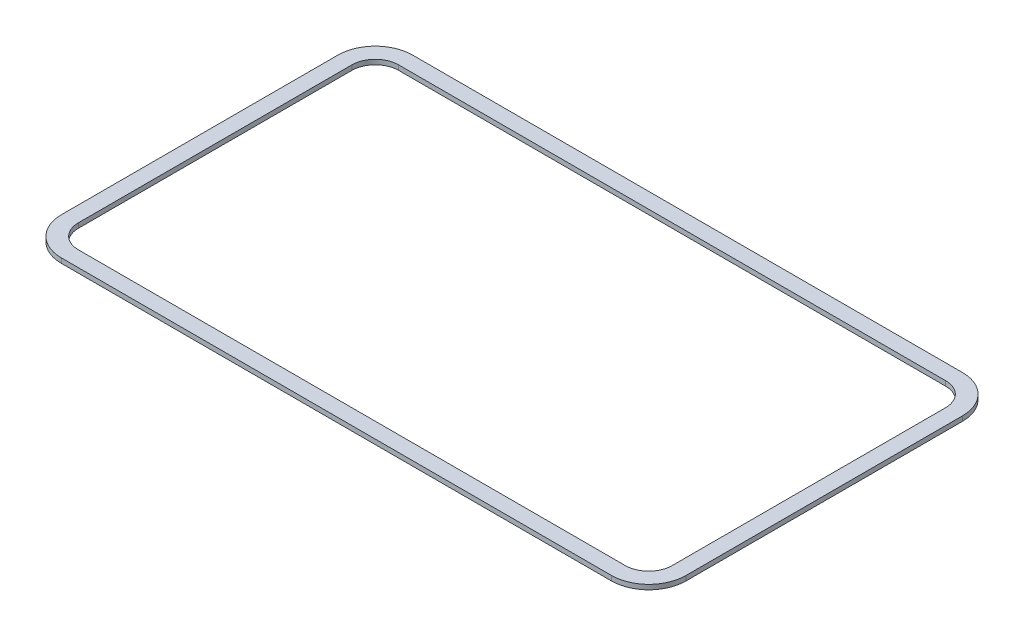
ISO-10303-21;
HEADER;
FILE_DESCRIPTION(('STEP AP214'),'2;1');
FILE_NAME('part.step','',(''),(''),'','','');
FILE_SCHEMA(('AUTOMOTIVE_DESIGN { 1 0 10303 214 1 1 1 1 }'));
ENDSEC;
DATA;
#1=APPLICATION_CONTEXT('core data for automotive mechanical design processes');
#2=APPLICATION_PROTOCOL_DEFINITION('international standard','automotive_design',2000,#1);
#3=PRODUCT_CONTEXT('',#1,'mechanical');
#4=PRODUCT('Part','Part','',(#3));
#5=PRODUCT_RELATED_PRODUCT_CATEGORY('part','',(#4));
#6=PRODUCT_DEFINITION_FORMATION('','',#4);
#7=PRODUCT_DEFINITION_CONTEXT('part definition',#1,'design');
#8=PRODUCT_DEFINITION('design','',#6,#7);
#9=PRODUCT_DEFINITION_SHAPE('','',#8);
#10=(LENGTH_UNIT() NAMED_UNIT(*) SI_UNIT(.MILLI.,.METRE.));
#11=(NAMED_UNIT(*) PLANE_ANGLE_UNIT() SI_UNIT($,.RADIAN.));
#12=(NAMED_UNIT(*) SI_UNIT($,.STERADIAN.) SOLID_ANGLE_UNIT());
#13=UNCERTAINTY_MEASURE_WITH_UNIT(LENGTH_MEASURE(1.E-05),#10,'distance_accuracy_value','');
#14=(GEOMETRIC_REPRESENTATION_CONTEXT(3) GLOBAL_UNCERTAINTY_ASSIGNED_CONTEXT((#13)) GLOBAL_UNIT_ASSIGNED_CONTEXT((#10,
#11,#12)) REPRESENTATION_CONTEXT('',''));
#15=CARTESIAN_POINT('',(0.,0.,0.));
#16=DIRECTION('',(0.,0.,1.));
#17=DIRECTION('',(1.,0.,0.));
#18=AXIS2_PLACEMENT_3D('',#15,#16,#17);
#19=CARTESIAN_POINT('',(-10.,114.579795605042,-10.));
#20=DIRECTION('',(0.,-1.,0.));
#21=DIRECTION('',(0.,0.,-1.));
#22=AXIS2_PLACEMENT_3D('',#19,#20,#21);
#23=CYLINDRICAL_SURFACE('',#22,7.7038728258217);
#24=CARTESIAN_POINT('',(-10.,113.001,-10.));
#25=DIRECTION('',(0.,1.,0.));
#26=DIRECTION('',(0.,0.,1.));
#27=AXIS2_PLACEMENT_3D('',#24,#25,#26);
#28=CIRCLE('',#27,7.7038728258217);
#29=CARTESIAN_POINT('',(-10.,113.001,-2.2961271741783));
#30=VERTEX_POINT('',#29);
#31=CARTESIAN_POINT('',(-2.29612717417829,113.001,-10.));
#32=VERTEX_POINT('',#31);
#33=EDGE_CURVE('E188',#30,#32,#28,.T.);
#34=ORIENTED_EDGE('',*,*,#33,.F.);
#35=DIRECTION('',(0.,-1.,0.));
#36=VECTOR('',#35,1.);
#37=CARTESIAN_POINT('',(-10.,114.579795605042,-2.2961271741783));
#38=LINE('',#37,#36);
#39=CARTESIAN_POINT('',(-10.,114.579795605042,-2.2961271741783));
#40=VERTEX_POINT('',#39);
#41=EDGE_CURVE('E35',#40,#30,#38,.T.);
#42=ORIENTED_EDGE('',*,*,#41,.F.);
#43=CARTESIAN_POINT('',(-10.,114.579795605042,-10.));
#44=DIRECTION('',(0.,1.,0.));
#45=DIRECTION('',(0.,0.,1.));
#46=AXIS2_PLACEMENT_3D('',#43,#44,#45);
#47=CIRCLE('',#46,7.7038728258217);
#48=CARTESIAN_POINT('',(-2.29612717417829,114.579795605042,-10.));
#49=VERTEX_POINT('',#48);
#50=EDGE_CURVE('E247',#40,#49,#47,.T.);
#51=ORIENTED_EDGE('',*,*,#50,.T.);
#52=DIRECTION('',(0.,-1.,0.));
#53=VECTOR('',#52,1.);
#54=CARTESIAN_POINT('',(-2.29612717417829,114.579795605042,-10.));
#55=LINE('',#54,#53);
#56=EDGE_CURVE('E10',#49,#32,#55,.T.);
#57=ORIENTED_EDGE('',*,*,#56,.T.);
#58=EDGE_LOOP('',(#34,#42,#51,#57));
#59=FACE_BOUND('',#58,.T.);
#60=ADVANCED_FACE('F16',(#59),#23,.F.);
#61=CARTESIAN_POINT('',(-2.29612717417829,114.579795605042,-10.));
#62=DIRECTION('',(-1.,0.,0.));
#63=DIRECTION('',(0.,0.,1.));
#64=AXIS2_PLACEMENT_3D('',#61,#62,#63);
#65=PLANE('',#64);
#66=DIRECTION('',(0.,0.,-1.));
#67=VECTOR('',#66,1.);
#68=CARTESIAN_POINT('',(-2.29612717417829,113.001,-10.));
#69=LINE('',#68,#67);
#70=CARTESIAN_POINT('',(-2.29612717417831,113.001,-100.));
#71=VERTEX_POINT('',#70);
#72=EDGE_CURVE('E191',#32,#71,#69,.T.);
#73=ORIENTED_EDGE('',*,*,#72,.F.);
#74=ORIENTED_EDGE('',*,*,#56,.F.);
#75=DIRECTION('',(0.,0.,-1.));
#76=VECTOR('',#75,1.);
#77=CARTESIAN_POINT('',(-2.29612717417829,114.579795605042,-10.));
#78=LINE('',#77,#76);
#79=CARTESIAN_POINT('',(-2.29612717417831,114.579795605042,-100.));
#80=VERTEX_POINT('',#79);
#81=EDGE_CURVE('E269',#49,#80,#78,.T.);
#82=ORIENTED_EDGE('',*,*,#81,.T.);
#83=DIRECTION('',(0.,-1.,0.));
#84=VECTOR('',#83,1.);
#85=CARTESIAN_POINT('',(-2.29612717417831,114.579795605042,-100.));
#86=LINE('',#85,#84);
#87=EDGE_CURVE('E26',#80,#71,#86,.T.);
#88=ORIENTED_EDGE('',*,*,#87,.T.);
#89=EDGE_LOOP('',(#73,#74,#82,#88));
#90=FACE_BOUND('',#89,.T.);
#91=ADVANCED_FACE('F291',(#90),#65,.T.);
#92=CARTESIAN_POINT('',(-10.,114.579795605042,-100.));
#93=DIRECTION('',(0.,-1.,0.));
#94=DIRECTION('',(0.,0.,-1.));
#95=AXIS2_PLACEMENT_3D('',#92,#93,#94);
#96=CYLINDRICAL_SURFACE('',#95,7.7038728258217);
#97=CARTESIAN_POINT('',(-10.,113.001,-100.));
#98=DIRECTION('',(0.,1.,0.));
#99=DIRECTION('',(1.,0.,0.));
#100=AXIS2_PLACEMENT_3D('',#97,#98,#99);
#101=CIRCLE('',#100,7.7038728258217);
#102=CARTESIAN_POINT('',(-10.,113.001,-107.703872825822));
#103=VERTEX_POINT('',#102);
#104=EDGE_CURVE('E194',#71,#103,#101,.T.);
#105=ORIENTED_EDGE('',*,*,#104,.F.);
#106=ORIENTED_EDGE('',*,*,#87,.F.);
#107=CARTESIAN_POINT('',(-10.,114.579795605042,-100.));
#108=DIRECTION('',(0.,1.,0.));
#109=DIRECTION('',(1.,0.,0.));
#110=AXIS2_PLACEMENT_3D('',#107,#108,#109);
#111=CIRCLE('',#110,7.7038728258217);
#112=CARTESIAN_POINT('',(-10.,114.579795605042,-107.703872825822));
#113=VERTEX_POINT('',#112);
#114=EDGE_CURVE('E272',#80,#113,#111,.T.);
#115=ORIENTED_EDGE('',*,*,#114,.T.);
#116=DIRECTION('',(0.,-1.,0.));
#117=VECTOR('',#116,1.);
#118=CARTESIAN_POINT('',(-10.,114.579795605042,-107.703872825822));
#119=LINE('',#118,#117);
#120=EDGE_CURVE('E214',#113,#103,#119,.T.);
#121=ORIENTED_EDGE('',*,*,#120,.T.);
#122=EDGE_LOOP('',(#105,#106,#115,#121));
#123=FACE_BOUND('',#122,.T.);
#124=ADVANCED_FACE('F288',(#123),#96,.F.);
#125=CARTESIAN_POINT('',(-10.,114.579795605042,-107.703872825822));
#126=DIRECTION('',(0.,0.,1.));
#127=DIRECTION('',(1.,0.,0.));
#128=AXIS2_PLACEMENT_3D('',#125,#126,#127);
#129=PLANE('',#128);
#130=DIRECTION('',(-1.,0.,0.));
#131=VECTOR('',#130,1.);
#132=CARTESIAN_POINT('',(-10.,113.001,-107.703872825822));
#133=LINE('',#132,#131);
#134=CARTESIAN_POINT('',(-190.,113.001,-107.703872825822));
#135=VERTEX_POINT('',#134);
#136=EDGE_CURVE('E197',#103,#135,#133,.T.);
#137=ORIENTED_EDGE('',*,*,#136,.F.);
#138=ORIENTED_EDGE('',*,*,#120,.F.);
#139=DIRECTION('',(-1.,0.,0.));
#140=VECTOR('',#139,1.);
#141=CARTESIAN_POINT('',(-10.,114.579795605042,-107.703872825822));
#142=LINE('',#141,#140);
#143=CARTESIAN_POINT('',(-190.,114.579795605042,-107.703872825822));
#144=VERTEX_POINT('',#143);
#145=EDGE_CURVE('E275',#113,#144,#142,.T.);
#146=ORIENTED_EDGE('',*,*,#145,.T.);
#147=DIRECTION('',(0.,-1.,0.));
#148=VECTOR('',#147,1.);
#149=CARTESIAN_POINT('',(-190.,114.579795605042,-107.703872825822));
#150=LINE('',#149,#148);
#151=EDGE_CURVE('E212',#144,#135,#150,.T.);
#152=ORIENTED_EDGE('',*,*,#151,.T.);
#153=EDGE_LOOP('',(#137,#138,#146,#152));
#154=FACE_BOUND('',#153,.T.);
#155=ADVANCED_FACE('F285',(#154),#129,.T.);
#156=CARTESIAN_POINT('',(-190.,114.579795605042,-100.));
#157=DIRECTION('',(0.,-1.,0.));
#158=DIRECTION('',(0.,0.,-1.));
#159=AXIS2_PLACEMENT_3D('',#156,#157,#158);
#160=CYLINDRICAL_SURFACE('',#159,7.7038728258217);
#161=CARTESIAN_POINT('',(-190.,113.001,-100.));
#162=DIRECTION('',(0.,1.,0.));
#163=DIRECTION('',(0.,0.,-1.));
#164=AXIS2_PLACEMENT_3D('',#161,#162,#163);
#165=CIRCLE('',#164,7.7038728258217);
#166=CARTESIAN_POINT('',(-197.703872825822,113.001,-100.));
#167=VERTEX_POINT('',#166);
#168=EDGE_CURVE('E200',#135,#167,#165,.T.);
#169=ORIENTED_EDGE('',*,*,#168,.F.);
#170=ORIENTED_EDGE('',*,*,#151,.F.);
#171=CARTESIAN_POINT('',(-190.,114.579795605042,-100.));
#172=DIRECTION('',(0.,1.,0.));
#173=DIRECTION('',(0.,0.,-1.));
#174=AXIS2_PLACEMENT_3D('',#171,#172,#173);
#175=CIRCLE('',#174,7.7038728258217);
#176=CARTESIAN_POINT('',(-197.703872825822,114.579795605042,-100.));
#177=VERTEX_POINT('',#176);
#178=EDGE_CURVE('E154',#144,#177,#175,.T.);
#179=ORIENTED_EDGE('',*,*,#178,.T.);
#180=DIRECTION('',(0.,-1.,0.));
#181=VECTOR('',#180,1.);
#182=CARTESIAN_POINT('',(-197.703872825822,114.579795605042,-100.));
#183=LINE('',#182,#181);
#184=EDGE_CURVE('E146',#177,#167,#183,.T.);
#185=ORIENTED_EDGE('',*,*,#184,.T.);
#186=EDGE_LOOP('',(#169,#170,#179,#185));
#187=FACE_BOUND('',#186,.T.);
#188=ADVANCED_FACE('F279',(#187),#160,.F.);
#189=CARTESIAN_POINT('',(-197.703872825822,114.579795605042,-100.));
#190=DIRECTION('',(1.,0.,0.));
#191=DIRECTION('',(0.,0.,-1.));
#192=AXIS2_PLACEMENT_3D('',#189,#190,#191);
#193=PLANE('',#192);
#194=DIRECTION('',(0.,0.,1.));
#195=VECTOR('',#194,1.);
#196=CARTESIAN_POINT('',(-197.703872825822,113.001,-100.));
#197=LINE('',#196,#195);
#198=CARTESIAN_POINT('',(-197.703872825822,113.001,-10.));
#199=VERTEX_POINT('',#198);
#200=EDGE_CURVE('E203',#167,#199,#197,.T.);
#201=ORIENTED_EDGE('',*,*,#200,.F.);
#202=ORIENTED_EDGE('',*,*,#184,.F.);
#203=DIRECTION('',(0.,0.,1.));
#204=VECTOR('',#203,1.);
#205=CARTESIAN_POINT('',(-197.703872825822,114.579795605042,-100.));
#206=LINE('',#205,#204);
#207=CARTESIAN_POINT('',(-197.703872825822,114.579795605042,-10.));
#208=VERTEX_POINT('',#207);
#209=EDGE_CURVE('E149',#177,#208,#206,.T.);
#210=ORIENTED_EDGE('',*,*,#209,.T.);
#211=DIRECTION('',(0.,-1.,0.));
#212=VECTOR('',#211,1.);
#213=CARTESIAN_POINT('',(-197.703872825822,114.579795605042,-10.));
#214=LINE('',#213,#212);
#215=EDGE_CURVE('E135',#208,#199,#214,.T.);
#216=ORIENTED_EDGE('',*,*,#215,.T.);
#217=EDGE_LOOP('',(#201,#202,#210,#216));
#218=FACE_BOUND('',#217,.T.);
#219=ADVANCED_FACE('F150',(#218),#193,.T.);
#220=CARTESIAN_POINT('',(-190.,114.579795605042,-10.));
#221=DIRECTION('',(0.,-1.,0.));
#222=DIRECTION('',(0.,0.,-1.));
#223=AXIS2_PLACEMENT_3D('',#220,#221,#222);
#224=CYLINDRICAL_SURFACE('',#223,7.70387282582172);
#225=CARTESIAN_POINT('',(-190.,113.001,-10.));
#226=DIRECTION('',(0.,1.,0.));
#227=DIRECTION('',(-1.,0.,0.));
#228=AXIS2_PLACEMENT_3D('',#225,#226,#227);
#229=CIRCLE('',#228,7.70387282582172);
#230=CARTESIAN_POINT('',(-190.,113.001,-2.29612717417829));
#231=VERTEX_POINT('',#230);
#232=EDGE_CURVE('E142',#199,#231,#229,.T.);
#233=ORIENTED_EDGE('',*,*,#232,.F.);
#234=ORIENTED_EDGE('',*,*,#215,.F.);
#235=CARTESIAN_POINT('',(-190.,114.579795605042,-10.));
#236=DIRECTION('',(0.,1.,0.));
#237=DIRECTION('',(-1.,0.,0.));
#238=AXIS2_PLACEMENT_3D('',#235,#236,#237);
#239=CIRCLE('',#238,7.70387282582172);
#240=CARTESIAN_POINT('',(-190.,114.579795605042,-2.29612717417829));
#241=VERTEX_POINT('',#240);
#242=EDGE_CURVE('E139',#208,#241,#239,.T.);
#243=ORIENTED_EDGE('',*,*,#242,.T.);
#244=DIRECTION('',(0.,-1.,0.));
#245=VECTOR('',#244,1.);
#246=CARTESIAN_POINT('',(-190.,114.579795605042,-2.29612717417829));
#247=LINE('',#246,#245);
#248=EDGE_CURVE('E87',#241,#231,#247,.T.);
#249=ORIENTED_EDGE('',*,*,#248,.T.);
#250=EDGE_LOOP('',(#233,#234,#243,#249));
#251=FACE_BOUND('',#250,.T.);
#252=ADVANCED_FACE('F137',(#251),#224,.F.);
#253=CARTESIAN_POINT('',(-190.5,114.579795605042,-100.5));
#254=DIRECTION('',(0.,-1.,0.));
#255=DIRECTION('',(0.,0.,-1.));
#256=AXIS2_PLACEMENT_3D('',#253,#254,#255);
#257=CYLINDRICAL_SURFACE('',#256,12.2961271741783);
#258=CARTESIAN_POINT('',(-190.5,113.001,-100.5));
#259=DIRECTION('',(0.,-1.,0.));
#260=DIRECTION('',(-1.,0.,0.));
#261=AXIS2_PLACEMENT_3D('',#258,#259,#260);
#262=CIRCLE('',#261,12.2961271741783);
#263=CARTESIAN_POINT('',(-202.796127174178,113.001,-100.5));
#264=VERTEX_POINT('',#263);
#265=CARTESIAN_POINT('',(-190.5,113.001,-112.796127174178));
#266=VERTEX_POINT('',#265);
#267=EDGE_CURVE('E164',#264,#266,#262,.T.);
#268=ORIENTED_EDGE('',*,*,#267,.F.);
#269=DIRECTION('',(0.,-1.,0.));
#270=VECTOR('',#269,1.);
#271=CARTESIAN_POINT('',(-202.796127174178,114.579795605042,-100.5));
#272=LINE('',#271,#270);
#273=CARTESIAN_POINT('',(-202.796127174178,114.579795605042,-100.5));
#274=VERTEX_POINT('',#273);
#275=EDGE_CURVE('E160',#274,#264,#272,.T.);
#276=ORIENTED_EDGE('',*,*,#275,.F.);
#277=CARTESIAN_POINT('',(-190.5,114.579795605042,-100.5));
#278=DIRECTION('',(0.,-1.,0.));
#279=DIRECTION('',(-1.,0.,0.));
#280=AXIS2_PLACEMENT_3D('',#277,#278,#279);
#281=CIRCLE('',#280,12.2961271741783);
#282=CARTESIAN_POINT('',(-190.5,114.579795605042,-112.796127174178));
#283=VERTEX_POINT('',#282);
#284=EDGE_CURVE('E208',#274,#283,#281,.T.);
#285=ORIENTED_EDGE('',*,*,#284,.T.);
#286=DIRECTION('',(0.,-1.,0.));
#287=VECTOR('',#286,1.);
#288=CARTESIAN_POINT('',(-190.5,114.579795605042,-112.796127174178));
#289=LINE('',#288,#287);
#290=EDGE_CURVE('E20',#283,#266,#289,.T.);
#291=ORIENTED_EDGE('',*,*,#290,.T.);
#292=EDGE_LOOP('',(#268,#276,#285,#291));
#293=FACE_BOUND('',#292,.T.);
#294=ADVANCED_FACE('F18',(#293),#257,.T.);
#295=CARTESIAN_POINT('',(-190.5,114.579795605042,-112.796127174178));
#296=DIRECTION('',(0.,0.,-1.));
#297=DIRECTION('',(-1.,0.,0.));
#298=AXIS2_PLACEMENT_3D('',#295,#296,#297);
#299=PLANE('',#298);
#300=DIRECTION('',(1.,0.,0.));
#301=VECTOR('',#300,1.);
#302=CARTESIAN_POINT('',(-190.5,113.001,-112.796127174178));
#303=LINE('',#302,#301);
#304=CARTESIAN_POINT('',(-9.50000000000001,113.001,-112.796127174178));
#305=VERTEX_POINT('',#304);
#306=EDGE_CURVE('E167',#266,#305,#303,.T.);
#307=ORIENTED_EDGE('',*,*,#306,.F.);
#308=ORIENTED_EDGE('',*,*,#290,.F.);
#309=DIRECTION('',(1.,0.,0.));
#310=VECTOR('',#309,1.);
#311=CARTESIAN_POINT('',(-190.5,114.579795605042,-112.796127174178));
#312=LINE('',#311,#310);
#313=CARTESIAN_POINT('',(-9.50000000000001,114.579795605042,-112.796127174178));
#314=VERTEX_POINT('',#313);
#315=EDGE_CURVE('E251',#283,#314,#312,.T.);
#316=ORIENTED_EDGE('',*,*,#315,.T.);
#317=DIRECTION('',(0.,-1.,0.));
#318=VECTOR('',#317,1.);
#319=CARTESIAN_POINT('',(-9.50000000000001,114.579795605042,-112.796127174178));
#320=LINE('',#319,#318);
#321=EDGE_CURVE('E227',#314,#305,#320,.T.);
#322=ORIENTED_EDGE('',*,*,#321,.T.);
#323=EDGE_LOOP('',(#307,#308,#316,#322));
#324=FACE_BOUND('',#323,.T.);
#325=ADVANCED_FACE('F233',(#324),#299,.T.);
#326=CARTESIAN_POINT('',(-9.50000000000001,114.579795605042,-100.5));
#327=DIRECTION('',(0.,-1.,0.));
#328=DIRECTION('',(0.,0.,-1.));
#329=AXIS2_PLACEMENT_3D('',#326,#327,#328);
#330=CYLINDRICAL_SURFACE('',#329,12.2961271741783);
#331=CARTESIAN_POINT('',(-9.50000000000001,113.001,-100.5));
#332=DIRECTION('',(0.,-1.,0.));
#333=DIRECTION('',(0.,0.,-1.));
#334=AXIS2_PLACEMENT_3D('',#331,#332,#333);
#335=CIRCLE('',#334,12.2961271741783);
#336=CARTESIAN_POINT('',(2.79612717417829,113.001,-100.5));
#337=VERTEX_POINT('',#336);
#338=EDGE_CURVE('E170',#305,#337,#335,.T.);
#339=ORIENTED_EDGE('',*,*,#338,.F.);
#340=ORIENTED_EDGE('',*,*,#321,.F.);
#341=CARTESIAN_POINT('',(-9.50000000000001,114.579795605042,-100.5));
#342=DIRECTION('',(0.,-1.,0.));
#343=DIRECTION('',(0.,0.,-1.));
#344=AXIS2_PLACEMENT_3D('',#341,#342,#343);
#345=CIRCLE('',#344,12.2961271741783);
#346=CARTESIAN_POINT('',(2.79612717417829,114.579795605042,-100.5));
#347=VERTEX_POINT('',#346);
#348=EDGE_CURVE('E253',#314,#347,#345,.T.);
#349=ORIENTED_EDGE('',*,*,#348,.T.);
#350=DIRECTION('',(0.,-1.,0.));
#351=VECTOR('',#350,1.);
#352=CARTESIAN_POINT('',(2.79612717417829,114.579795605042,-100.5));
#353=LINE('',#352,#351);
#354=EDGE_CURVE('E226',#347,#337,#353,.T.);
#355=ORIENTED_EDGE('',*,*,#354,.T.);
#356=EDGE_LOOP('',(#339,#340,#349,#355));
#357=FACE_BOUND('',#356,.T.);
#358=ADVANCED_FACE('F327',(#357),#330,.T.);
#359=CARTESIAN_POINT('',(2.7961271741783,114.579795605042,-100.5));
#360=DIRECTION('',(1.,0.,0.));
#361=DIRECTION('',(0.,0.,-1.));
#362=AXIS2_PLACEMENT_3D('',#359,#360,#361);
#363=PLANE('',#362);
#364=DIRECTION('',(0.,0.,1.));
#365=VECTOR('',#364,1.);
#366=CARTESIAN_POINT('',(2.7961271741783,113.001,-100.5));
#367=LINE('',#366,#365);
#368=CARTESIAN_POINT('',(2.79612717417832,113.001,-9.49999999999997));
#369=VERTEX_POINT('',#368);
#370=EDGE_CURVE('E173',#337,#369,#367,.T.);
#371=ORIENTED_EDGE('',*,*,#370,.F.);
#372=ORIENTED_EDGE('',*,*,#354,.F.);
#373=DIRECTION('',(0.,0.,1.));
#374=VECTOR('',#373,1.);
#375=CARTESIAN_POINT('',(2.7961271741783,114.579795605042,-100.5));
#376=LINE('',#375,#374);
#377=CARTESIAN_POINT('',(2.79612717417832,114.579795605042,-9.49999999999997));
#378=VERTEX_POINT('',#377);
#379=EDGE_CURVE('E258',#347,#378,#376,.T.);
#380=ORIENTED_EDGE('',*,*,#379,.T.);
#381=DIRECTION('',(0.,-1.,0.));
#382=VECTOR('',#381,1.);
#383=CARTESIAN_POINT('',(2.79612717417832,114.579795605042,-9.49999999999997));
#384=LINE('',#383,#382);
#385=EDGE_CURVE('E224',#378,#369,#384,.T.);
#386=ORIENTED_EDGE('',*,*,#385,.T.);
#387=EDGE_LOOP('',(#371,#372,#380,#386));
#388=FACE_BOUND('',#387,.T.);
#389=ADVANCED_FACE('F323',(#388),#363,.T.);
#390=CARTESIAN_POINT('',(-9.49999999999998,114.579795605042,-9.49999999999997));
#391=DIRECTION('',(0.,-1.,0.));
#392=DIRECTION('',(0.,0.,-1.));
#393=AXIS2_PLACEMENT_3D('',#390,#391,#392);
#394=CYLINDRICAL_SURFACE('',#393,12.2961271741783);
#395=CARTESIAN_POINT('',(-9.49999999999998,113.001,-9.49999999999997));
#396=DIRECTION('',(0.,-1.,0.));
#397=DIRECTION('',(1.,0.,0.));
#398=AXIS2_PLACEMENT_3D('',#395,#396,#397);
#399=CIRCLE('',#398,12.2961271741783);
#400=CARTESIAN_POINT('',(-9.49999999999998,113.001,2.79612717417832));
#401=VERTEX_POINT('',#400);
#402=EDGE_CURVE('E176',#369,#401,#399,.T.);
#403=ORIENTED_EDGE('',*,*,#402,.F.);
#404=ORIENTED_EDGE('',*,*,#385,.F.);
#405=CARTESIAN_POINT('',(-9.49999999999998,114.579795605042,-9.49999999999997));
#406=DIRECTION('',(0.,-1.,0.));
#407=DIRECTION('',(1.,0.,0.));
#408=AXIS2_PLACEMENT_3D('',#405,#406,#407);
#409=CIRCLE('',#408,12.2961271741783);
#410=CARTESIAN_POINT('',(-9.49999999999998,114.579795605042,2.79612717417832));
#411=VERTEX_POINT('',#410);
#412=EDGE_CURVE('E261',#378,#411,#409,.T.);
#413=ORIENTED_EDGE('',*,*,#412,.T.);
#414=DIRECTION('',(0.,-1.,0.));
#415=VECTOR('',#414,1.);
#416=CARTESIAN_POINT('',(-9.49999999999998,114.579795605042,2.79612717417832));
#417=LINE('',#416,#415);
#418=EDGE_CURVE('E222',#411,#401,#417,.T.);
#419=ORIENTED_EDGE('',*,*,#418,.T.);
#420=EDGE_LOOP('',(#403,#404,#413,#419));
#421=FACE_BOUND('',#420,.T.);
#422=ADVANCED_FACE('F319',(#421),#394,.T.);
#423=CARTESIAN_POINT('',(-9.49999999999998,114.579795605042,2.79612717417832));
#424=DIRECTION('',(0.,0.,1.));
#425=DIRECTION('',(1.,0.,0.));
#426=AXIS2_PLACEMENT_3D('',#423,#424,#425);
#427=PLANE('',#426);
#428=DIRECTION('',(-1.,0.,0.));
#429=VECTOR('',#428,1.);
#430=CARTESIAN_POINT('',(-9.49999999999998,113.001,2.79612717417832));
#431=LINE('',#430,#429);
#432=CARTESIAN_POINT('',(-190.5,113.001,2.7961271741783));
#433=VERTEX_POINT('',#432);
#434=EDGE_CURVE('E179',#401,#433,#431,.T.);
#435=ORIENTED_EDGE('',*,*,#434,.F.);
#436=ORIENTED_EDGE('',*,*,#418,.F.);
#437=DIRECTION('',(-1.,0.,0.));
#438=VECTOR('',#437,1.);
#439=CARTESIAN_POINT('',(-9.49999999999998,114.579795605042,2.79612717417832));
#440=LINE('',#439,#438);
#441=CARTESIAN_POINT('',(-190.5,114.579795605042,2.7961271741783));
#442=VERTEX_POINT('',#441);
#443=EDGE_CURVE('E264',#411,#442,#440,.T.);
#444=ORIENTED_EDGE('',*,*,#443,.T.);
#445=DIRECTION('',(0.,-1.,0.));
#446=VECTOR('',#445,1.);
#447=CARTESIAN_POINT('',(-190.5,114.579795605042,2.7961271741783));
#448=LINE('',#447,#446);
#449=EDGE_CURVE('E220',#442,#433,#448,.T.);
#450=ORIENTED_EDGE('',*,*,#449,.T.);
#451=EDGE_LOOP('',(#435,#436,#444,#450));
#452=FACE_BOUND('',#451,.T.);
#453=ADVANCED_FACE('F315',(#452),#427,.T.);
#454=CARTESIAN_POINT('',(-190.5,114.579795605042,-9.49999999999999));
#455=DIRECTION('',(0.,-1.,0.));
#456=DIRECTION('',(0.,0.,-1.));
#457=AXIS2_PLACEMENT_3D('',#454,#455,#456);
#458=CYLINDRICAL_SURFACE('',#457,12.2961271741783);
#459=CARTESIAN_POINT('',(-190.5,113.001,-9.49999999999999));
#460=DIRECTION('',(0.,-1.,0.));
#461=DIRECTION('',(0.,0.,1.));
#462=AXIS2_PLACEMENT_3D('',#459,#460,#461);
#463=CIRCLE('',#462,12.2961271741783);
#464=CARTESIAN_POINT('',(-202.796127174178,113.001,-9.49999999999999));
#465=VERTEX_POINT('',#464);
#466=EDGE_CURVE('E182',#433,#465,#463,.T.);
#467=ORIENTED_EDGE('',*,*,#466,.F.);
#468=ORIENTED_EDGE('',*,*,#449,.F.);
#469=CARTESIAN_POINT('',(-190.5,114.579795605042,-9.49999999999999));
#470=DIRECTION('',(0.,-1.,0.));
#471=DIRECTION('',(0.,0.,1.));
#472=AXIS2_PLACEMENT_3D('',#469,#470,#471);
#473=CIRCLE('',#472,12.2961271741783);
#474=CARTESIAN_POINT('',(-202.796127174178,114.579795605042,-9.49999999999999));
#475=VERTEX_POINT('',#474);
#476=EDGE_CURVE('E248',#442,#475,#473,.T.);
#477=ORIENTED_EDGE('',*,*,#476,.T.);
#478=DIRECTION('',(0.,-1.,0.));
#479=VECTOR('',#478,1.);
#480=CARTESIAN_POINT('',(-202.796127174178,114.579795605042,-9.49999999999999));
#481=LINE('',#480,#479);
#482=EDGE_CURVE('E218',#475,#465,#481,.T.);
#483=ORIENTED_EDGE('',*,*,#482,.T.);
#484=EDGE_LOOP('',(#467,#468,#477,#483));
#485=FACE_BOUND('',#484,.T.);
#486=ADVANCED_FACE('F301',(#485),#458,.T.);
#487=CARTESIAN_POINT('',(-202.796127174178,114.579795605042,-9.49999999999999));
#488=DIRECTION('',(-1.,0.,0.));
#489=DIRECTION('',(0.,0.,1.));
#490=AXIS2_PLACEMENT_3D('',#487,#488,#489);
#491=PLANE('',#490);
#492=DIRECTION('',(0.,0.,-1.));
#493=VECTOR('',#492,1.);
#494=CARTESIAN_POINT('',(-202.796127174178,113.001,-9.49999999999999));
#495=LINE('',#494,#493);
#496=EDGE_CURVE('E185',#465,#264,#495,.T.);
#497=ORIENTED_EDGE('',*,*,#496,.F.);
#498=ORIENTED_EDGE('',*,*,#482,.F.);
#499=DIRECTION('',(0.,0.,-1.));
#500=VECTOR('',#499,1.);
#501=CARTESIAN_POINT('',(-202.796127174178,114.579795605042,-9.49999999999999));
#502=LINE('',#501,#500);
#503=EDGE_CURVE('E244',#475,#274,#502,.T.);
#504=ORIENTED_EDGE('',*,*,#503,.T.);
#505=ORIENTED_EDGE('',*,*,#275,.T.);
#506=EDGE_LOOP('',(#497,#498,#504,#505));
#507=FACE_BOUND('',#506,.T.);
#508=ADVANCED_FACE('F240',(#507),#491,.T.);
#509=CARTESIAN_POINT('',(-190.,114.579795605042,-2.29612717417829));
#510=DIRECTION('',(0.,0.,-1.));
#511=DIRECTION('',(-1.,0.,0.));
#512=AXIS2_PLACEMENT_3D('',#509,#510,#511);
#513=PLANE('',#512);
#514=DIRECTION('',(1.,0.,0.));
#515=VECTOR('',#514,1.);
#516=CARTESIAN_POINT('',(-190.,113.001,-2.29612717417829));
#517=LINE('',#516,#515);
#518=EDGE_CURVE('E206',#231,#30,#517,.T.);
#519=ORIENTED_EDGE('',*,*,#518,.F.);
#520=ORIENTED_EDGE('',*,*,#248,.F.);
#521=DIRECTION('',(1.,0.,0.));
#522=VECTOR('',#521,1.);
#523=CARTESIAN_POINT('',(-190.,114.579795605042,-2.29612717417829));
#524=LINE('',#523,#522);
#525=EDGE_CURVE('E158',#241,#40,#524,.T.);
#526=ORIENTED_EDGE('',*,*,#525,.T.);
#527=ORIENTED_EDGE('',*,*,#41,.T.);
#528=EDGE_LOOP('',(#519,#520,#526,#527));
#529=FACE_BOUND('',#528,.T.);
#530=ADVANCED_FACE('F292',(#529),#513,.T.);
#531=CARTESIAN_POINT('',(-100.,114.579795605042,0.500000000000017));
#532=DIRECTION('',(0.,-1.,0.));
#533=DIRECTION('',(1.,0.,0.));
#534=AXIS2_PLACEMENT_3D('',#531,#532,#533);
#535=PLANE('',#534);
#536=ORIENTED_EDGE('',*,*,#284,.F.);
#537=ORIENTED_EDGE('',*,*,#503,.F.);
#538=ORIENTED_EDGE('',*,*,#476,.F.);
#539=ORIENTED_EDGE('',*,*,#443,.F.);
#540=ORIENTED_EDGE('',*,*,#412,.F.);
#541=ORIENTED_EDGE('',*,*,#379,.F.);
#542=ORIENTED_EDGE('',*,*,#348,.F.);
#543=ORIENTED_EDGE('',*,*,#315,.F.);
#544=EDGE_LOOP('',(#536,#537,#538,#539,#540,#541,#542,#543));
#545=FACE_BOUND('',#544,.T.);
#546=ORIENTED_EDGE('',*,*,#50,.F.);
#547=ORIENTED_EDGE('',*,*,#525,.F.);
#548=ORIENTED_EDGE('',*,*,#242,.F.);
#549=ORIENTED_EDGE('',*,*,#209,.F.);
#550=ORIENTED_EDGE('',*,*,#178,.F.);
#551=ORIENTED_EDGE('',*,*,#145,.F.);
#552=ORIENTED_EDGE('',*,*,#114,.F.);
#553=ORIENTED_EDGE('',*,*,#81,.F.);
#554=EDGE_LOOP('',(#546,#547,#548,#549,#550,#551,#552,#553));
#555=FACE_BOUND('',#554,.T.);
#556=ADVANCED_FACE('F157',(#545,#555),#535,.F.);
#557=CARTESIAN_POINT('',(-100.,113.001,0.500000000000017));
#558=DIRECTION('',(0.,-1.,0.));
#559=DIRECTION('',(1.,0.,0.));
#560=AXIS2_PLACEMENT_3D('',#557,#558,#559);
#561=PLANE('',#560);
#562=ORIENTED_EDGE('',*,*,#267,.T.);
#563=ORIENTED_EDGE('',*,*,#306,.T.);
#564=ORIENTED_EDGE('',*,*,#338,.T.);
#565=ORIENTED_EDGE('',*,*,#370,.T.);
#566=ORIENTED_EDGE('',*,*,#402,.T.);
#567=ORIENTED_EDGE('',*,*,#434,.T.);
#568=ORIENTED_EDGE('',*,*,#466,.T.);
#569=ORIENTED_EDGE('',*,*,#496,.T.);
#570=EDGE_LOOP('',(#562,#563,#564,#565,#566,#567,#568,#569));
#571=FACE_BOUND('',#570,.T.);
#572=ORIENTED_EDGE('',*,*,#33,.T.);
#573=ORIENTED_EDGE('',*,*,#72,.T.);
#574=ORIENTED_EDGE('',*,*,#104,.T.);
#575=ORIENTED_EDGE('',*,*,#136,.T.);
#576=ORIENTED_EDGE('',*,*,#168,.T.);
#577=ORIENTED_EDGE('',*,*,#200,.T.);
#578=ORIENTED_EDGE('',*,*,#232,.T.);
#579=ORIENTED_EDGE('',*,*,#518,.T.);
#580=EDGE_LOOP('',(#572,#573,#574,#575,#576,#577,#578,#579));
#581=FACE_BOUND('',#580,.T.);
#582=ADVANCED_FACE('F235',(#571,#581),#561,.T.);
#583=CLOSED_SHELL('',(#60,#91,#124,#155,#188,#219,#252,#294,#325,#358,#389,#422,#453,#486,#508,
#530,#556,#582));
#584=MANIFOLD_SOLID_BREP('B1',#583);
#585=ADVANCED_BREP_SHAPE_REPRESENTATION('',(#18,#584),#14);
#586=SHAPE_DEFINITION_REPRESENTATION(#9,#585);
ENDSEC;
END-ISO-10303-21;
